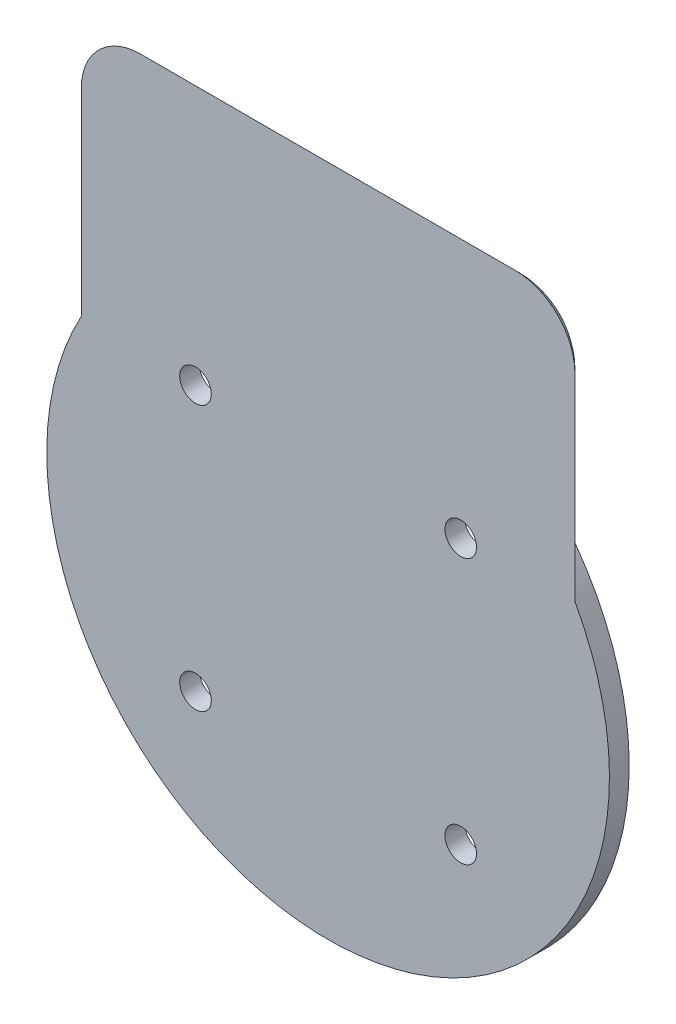
ISO-10303-21;
HEADER;
FILE_DESCRIPTION(('STEP AP214'),'2;1');
FILE_NAME('part.step','',(''),(''),'','','');
FILE_SCHEMA(('AUTOMOTIVE_DESIGN { 1 0 10303 214 1 1 1 1 }'));
ENDSEC;
DATA;
#1=APPLICATION_CONTEXT('core data for automotive mechanical design processes');
#2=APPLICATION_PROTOCOL_DEFINITION('international standard','automotive_design',2000,#1);
#3=PRODUCT_CONTEXT('',#1,'mechanical');
#4=PRODUCT('Part','Part','',(#3));
#5=PRODUCT_RELATED_PRODUCT_CATEGORY('part','',(#4));
#6=PRODUCT_DEFINITION_FORMATION('','',#4);
#7=PRODUCT_DEFINITION_CONTEXT('part definition',#1,'design');
#8=PRODUCT_DEFINITION('design','',#6,#7);
#9=PRODUCT_DEFINITION_SHAPE('','',#8);
#10=(LENGTH_UNIT() NAMED_UNIT(*) SI_UNIT(.MILLI.,.METRE.));
#11=(NAMED_UNIT(*) PLANE_ANGLE_UNIT() SI_UNIT($,.RADIAN.));
#12=(NAMED_UNIT(*) SI_UNIT($,.STERADIAN.) SOLID_ANGLE_UNIT());
#13=UNCERTAINTY_MEASURE_WITH_UNIT(LENGTH_MEASURE(1.E-05),#10,'distance_accuracy_value','');
#14=(GEOMETRIC_REPRESENTATION_CONTEXT(3) GLOBAL_UNCERTAINTY_ASSIGNED_CONTEXT((#13)) GLOBAL_UNIT_ASSIGNED_CONTEXT((#10,
#11,#12)) REPRESENTATION_CONTEXT('',''));
#15=CARTESIAN_POINT('',(0.,0.,0.));
#16=DIRECTION('',(0.,0.,1.));
#17=DIRECTION('',(1.,0.,0.));
#18=AXIS2_PLACEMENT_3D('',#15,#16,#17);
#19=CARTESIAN_POINT('',(-20.5278640450004,39.696938456699,-41.1));
#20=DIRECTION('',(0.,1.,0.));
#21=DIRECTION('',(0.,0.,1.));
#22=AXIS2_PLACEMENT_3D('',#19,#20,#21);
#23=CYLINDRICAL_SURFACE('',#22,6.);
#24=CARTESIAN_POINT('',(-25.,13.683932183404,-45.1));
#25=CARTESIAN_POINT('',(-24.9316533155713,13.8088031852223,-45.1764172188959));
#26=CARTESIAN_POINT('',(-24.8618021385521,13.9341930945905,-45.2506308573999));
#27=CARTESIAN_POINT('',(-24.7182644864457,14.1872754965675,-45.3956130666582));
#28=CARTESIAN_POINT('',(-24.644541913068,14.3149775198263,-45.4663292862519));
#29=CARTESIAN_POINT('',(-24.4931224391885,14.5725621096499,-45.6043165018991));
#30=CARTESIAN_POINT('',(-24.4153867515581,14.7024516673644,-45.6715318269254));
#31=CARTESIAN_POINT('',(-24.2558039743493,14.9642838700858,-45.8025256346511));
#32=CARTESIAN_POINT('',(-24.1739156060231,15.0962306010384,-45.8662456207196));
#33=CARTESIAN_POINT('',(-24.0087420272724,15.3575296447451,-45.9881254744884));
#34=CARTESIAN_POINT('',(-23.9255182847284,15.4868806193468,-46.0463715532978));
#35=CARTESIAN_POINT('',(-23.7563917629794,15.7450814461624,-46.1584324406634));
#36=CARTESIAN_POINT('',(-23.6704984335465,15.8739315748998,-46.2122608639766));
#37=CARTESIAN_POINT('',(-23.4960164446541,16.131066072179,-46.3154930018066));
#38=CARTESIAN_POINT('',(-23.407434939486,16.2593510526541,-46.3649072806787));
#39=CARTESIAN_POINT('',(-23.2275611020859,16.5152907344837,-46.4593159150301));
#40=CARTESIAN_POINT('',(-23.1362736437339,16.6429461371783,-46.5043176549434));
#41=CARTESIAN_POINT('',(-22.948084209444,16.9015315597402,-46.5912268794279));
#42=CARTESIAN_POINT('',(-22.8510959330607,17.0324440537818,-46.6329998840194));
#43=CARTESIAN_POINT('',(-22.6553511049898,17.2919391436373,-46.7111892522548));
#44=CARTESIAN_POINT('',(-22.5566299735149,17.4205307999583,-46.7476641291829));
#45=CARTESIAN_POINT('',(-22.3574848599523,17.675370557839,-46.8152622892751));
#46=CARTESIAN_POINT('',(-22.2570927390889,17.8016287197939,-46.8464414032887));
#47=CARTESIAN_POINT('',(-22.0546712300808,18.0517892039786,-46.9034516059615));
#48=CARTESIAN_POINT('',(-21.9526700631293,18.1757023455766,-46.9293353633259));
#49=CARTESIAN_POINT('',(-21.7416052093713,18.4277176755639,-46.9769915163599));
#50=CARTESIAN_POINT('',(-21.6324273277222,18.5557675653302,-46.9985360433891));
#51=CARTESIAN_POINT('',(-21.4132957409624,18.8081954729323,-47.0353802749903));
#52=CARTESIAN_POINT('',(-21.303388216914,18.9325986761571,-47.0507816676873));
#53=CARTESIAN_POINT('',(-21.0829244329362,19.1777740296513,-47.0753437096773));
#54=CARTESIAN_POINT('',(-20.9724082413396,19.2985722835046,-47.0846023871152));
#55=CARTESIAN_POINT('',(-20.750860133962,19.536577788044,-47.0968849346238));
#56=CARTESIAN_POINT('',(-20.6398619848515,19.6538117032703,-47.1000020380605));
#57=CARTESIAN_POINT('',(-20.5278640450005,19.7700985771437,-47.1));
#58=B_SPLINE_CURVE_WITH_KNOTS('',3,(#24,#25,#26,#27,#28,#29,#30,#31,#32,#33,#34,#35,#36,#37,#38,
#39,#40,#41,#42,#43,#44,#45,#46,#47,#48,#49,#50,#51,#52,#53,#54,#55,#56,#57),.UNSPECIFIED.,.F.,
.F.,(4,2,2,2,2,2,2,2,2,2,2,2,2,2,2,2,4),(0.,0.484668889562587,0.975183788082561,
1.47197597251438,1.97546058721739,2.46879216470734,2.9605412964569,3.45108009645755,
3.94078343778041,4.44527498435464,4.94368377681256,5.43645886362889,5.92406485820296,
6.43288522813079,6.93289368253222,7.42471748726127,7.90901571203432),.UNSPECIFIED.);
#59=CARTESIAN_POINT('',(-25.,13.683932183404,-45.1));
#60=VERTEX_POINT('',#59);
#61=CARTESIAN_POINT('',(-20.5278640450004,19.7700985771437,-47.1));
#62=VERTEX_POINT('',#61);
#63=EDGE_CURVE('E160',#60,#62,#58,.T.);
#64=ORIENTED_EDGE('',*,*,#63,.F.);
#65=DIRECTION('',(0.,1.,0.));
#66=VECTOR('',#65,1.);
#67=CARTESIAN_POINT('',(-25.,39.696938456699,-45.1));
#68=LINE('',#67,#66);
#69=CARTESIAN_POINT('',(-25.,33.6969384566991,-45.1));
#70=VERTEX_POINT('',#69);
#71=EDGE_CURVE('E139',#60,#70,#68,.T.);
#72=ORIENTED_EDGE('',*,*,#71,.T.);
#73=CARTESIAN_POINT('',(-20.5278640450004,33.6969384566991,-41.1));
#74=DIRECTION('',(0.,-1.,0.));
#75=DIRECTION('',(0.,0.,-1.));
#76=AXIS2_PLACEMENT_3D('',#73,#74,#75);
#77=CIRCLE('',#76,6.);
#78=CARTESIAN_POINT('',(-20.5278640450004,33.6969384566991,-47.1));
#79=VERTEX_POINT('',#78);
#80=EDGE_CURVE('E13',#70,#79,#77,.T.);
#81=ORIENTED_EDGE('',*,*,#80,.T.);
#82=DIRECTION('',(0.,1.,0.));
#83=VECTOR('',#82,1.);
#84=CARTESIAN_POINT('',(-20.5278640450004,33.6969384566991,-47.1));
#85=LINE('',#84,#83);
#86=EDGE_CURVE('E137',#62,#79,#85,.T.);
#87=ORIENTED_EDGE('',*,*,#86,.F.);
#88=EDGE_LOOP('',(#64,#72,#81,#87));
#89=FACE_BOUND('',#88,.T.);
#90=ADVANCED_FACE('F63',(#89),#23,.T.);
#91=CARTESIAN_POINT('',(-19.,33.6969384566991,-41.1));
#92=DIRECTION('',(0.,0.,1.));
#93=DIRECTION('',(1.,0.,0.));
#94=AXIS2_PLACEMENT_3D('',#91,#92,#93);
#95=DEGENERATE_TOROIDAL_SURFACE('',#94,1.52786404500042,6.,.T.);
#96=CARTESIAN_POINT('',(-19.,35.2248025016995,-41.1));
#97=DIRECTION('',(-1.,0.,0.));
#98=DIRECTION('',(0.,0.,1.));
#99=AXIS2_PLACEMENT_3D('',#96,#97,#98);
#100=CIRCLE('',#99,6.);
#101=CARTESIAN_POINT('',(-19.,39.696938456699,-45.1));
#102=VERTEX_POINT('',#101);
#103=CARTESIAN_POINT('',(-19.,35.2248025016995,-47.1));
#104=VERTEX_POINT('',#103);
#105=EDGE_CURVE('E73',#102,#104,#100,.T.);
#106=ORIENTED_EDGE('',*,*,#105,.T.);
#107=CARTESIAN_POINT('',(-19.,33.6969384566991,-47.1));
#108=DIRECTION('',(0.,0.,-1.));
#109=DIRECTION('',(-1.,0.,0.));
#110=AXIS2_PLACEMENT_3D('',#107,#108,#109);
#111=CIRCLE('',#110,1.52786404500041);
#112=EDGE_CURVE('E142',#79,#104,#111,.T.);
#113=ORIENTED_EDGE('',*,*,#112,.F.);
#114=ORIENTED_EDGE('',*,*,#80,.F.);
#115=CARTESIAN_POINT('',(-19.,33.6969384566991,-45.1));
#116=DIRECTION('',(0.,0.,1.));
#117=DIRECTION('',(-1.,0.,0.));
#118=AXIS2_PLACEMENT_3D('',#115,#116,#117);
#119=CIRCLE('',#118,6.);
#120=EDGE_CURVE('E287',#102,#70,#119,.T.);
#121=ORIENTED_EDGE('',*,*,#120,.F.);
#122=EDGE_LOOP('',(#106,#113,#114,#121));
#123=FACE_BOUND('',#122,.T.);
#124=ADVANCED_FACE('F143',(#123),#95,.T.);
#125=CARTESIAN_POINT('',(25.,35.2248025016995,-41.1));
#126=DIRECTION('',(1.,0.,0.));
#127=DIRECTION('',(0.,0.,-1.));
#128=AXIS2_PLACEMENT_3D('',#125,#126,#127);
#129=CYLINDRICAL_SURFACE('',#128,6.);
#130=CARTESIAN_POINT('',(19.,35.2248025016995,-41.1));
#131=DIRECTION('',(-1.,0.,0.));
#132=DIRECTION('',(0.,0.,1.));
#133=AXIS2_PLACEMENT_3D('',#130,#131,#132);
#134=CIRCLE('',#133,6.);
#135=CARTESIAN_POINT('',(19.,39.696938456699,-45.1));
#136=VERTEX_POINT('',#135);
#137=CARTESIAN_POINT('',(19.,35.2248025016995,-47.1));
#138=VERTEX_POINT('',#137);
#139=EDGE_CURVE('E286',#136,#138,#134,.T.);
#140=ORIENTED_EDGE('',*,*,#139,.T.);
#141=DIRECTION('',(1.,0.,0.));
#142=VECTOR('',#141,1.);
#143=CARTESIAN_POINT('',(19.,35.2248025016995,-47.1));
#144=LINE('',#143,#142);
#145=EDGE_CURVE('E147',#104,#138,#144,.T.);
#146=ORIENTED_EDGE('',*,*,#145,.F.);
#147=ORIENTED_EDGE('',*,*,#105,.F.);
#148=DIRECTION('',(1.,0.,0.));
#149=VECTOR('',#148,1.);
#150=CARTESIAN_POINT('',(25.,39.696938456699,-45.1));
#151=LINE('',#150,#149);
#152=EDGE_CURVE('E491',#102,#136,#151,.T.);
#153=ORIENTED_EDGE('',*,*,#152,.T.);
#154=EDGE_LOOP('',(#140,#146,#147,#153));
#155=FACE_BOUND('',#154,.T.);
#156=ADVANCED_FACE('F267',(#155),#129,.T.);
#157=CARTESIAN_POINT('',(19.,33.6969384566991,-41.1));
#158=DIRECTION('',(0.,0.,1.));
#159=DIRECTION('',(1.,0.,0.));
#160=AXIS2_PLACEMENT_3D('',#157,#158,#159);
#161=DEGENERATE_TOROIDAL_SURFACE('',#160,1.52786404500042,6.,.T.);
#162=CARTESIAN_POINT('',(20.5278640450004,33.6969384566991,-41.1));
#163=DIRECTION('',(0.,1.,0.));
#164=DIRECTION('',(0.,0.,1.));
#165=AXIS2_PLACEMENT_3D('',#162,#163,#164);
#166=CIRCLE('',#165,6.);
#167=CARTESIAN_POINT('',(25.,33.6969384566991,-45.1));
#168=VERTEX_POINT('',#167);
#169=CARTESIAN_POINT('',(20.5278640450004,33.6969384566991,-47.1));
#170=VERTEX_POINT('',#169);
#171=EDGE_CURVE('E283',#168,#170,#166,.T.);
#172=ORIENTED_EDGE('',*,*,#171,.T.);
#173=CARTESIAN_POINT('',(19.,33.6969384566991,-47.1));
#174=DIRECTION('',(0.,0.,-1.));
#175=DIRECTION('',(-1.,0.,0.));
#176=AXIS2_PLACEMENT_3D('',#173,#174,#175);
#177=CIRCLE('',#176,1.52786404500041);
#178=EDGE_CURVE('E371',#138,#170,#177,.T.);
#179=ORIENTED_EDGE('',*,*,#178,.F.);
#180=ORIENTED_EDGE('',*,*,#139,.F.);
#181=CARTESIAN_POINT('',(19.,33.6969384566991,-45.1));
#182=DIRECTION('',(0.,0.,1.));
#183=DIRECTION('',(-1.,0.,0.));
#184=AXIS2_PLACEMENT_3D('',#181,#182,#183);
#185=CIRCLE('',#184,6.);
#186=EDGE_CURVE('E365',#168,#136,#185,.T.);
#187=ORIENTED_EDGE('',*,*,#186,.F.);
#188=EDGE_LOOP('',(#172,#179,#180,#187));
#189=FACE_BOUND('',#188,.T.);
#190=ADVANCED_FACE('F386',(#189),#161,.T.);
#191=CARTESIAN_POINT('',(20.5278640450004,13.683932183404,-41.1));
#192=DIRECTION('',(0.,-1.,0.));
#193=DIRECTION('',(0.,0.,-1.));
#194=AXIS2_PLACEMENT_3D('',#191,#192,#193);
#195=CYLINDRICAL_SURFACE('',#194,6.);
#196=CARTESIAN_POINT('',(20.5278640450004,19.7700985771437,-47.1));
#197=CARTESIAN_POINT('',(20.6393434267797,19.6543500698832,-47.1000019568575));
#198=CARTESIAN_POINT('',(20.7498323429263,19.5376632403983,-47.096913202029));
#199=CARTESIAN_POINT('',(20.9703709706352,19.3007795761109,-47.0847419028513));
#200=CARTESIAN_POINT('',(21.0803873161818,19.1805563706097,-47.0755671764144));
#201=CARTESIAN_POINT('',(21.2998618004539,18.9365591094565,-47.0512274356552));
#202=CARTESIAN_POINT('',(21.4092803771805,18.812759236273,-47.0359655382079));
#203=CARTESIAN_POINT('',(21.6274458303953,18.5615662510633,-46.9994550951009));
#204=CARTESIAN_POINT('',(21.7361471356976,18.4341482220106,-46.9781060858789));
#205=CARTESIAN_POINT('',(21.946151280807,18.1835641156817,-46.930913905925));
#206=CARTESIAN_POINT('',(22.0475709931338,18.0604517338331,-46.9053043376565));
#207=CARTESIAN_POINT('',(22.2488625608406,17.8119049947444,-46.848899815042));
#208=CARTESIAN_POINT('',(22.348706452968,17.6864598701852,-46.8180525719507));
#209=CARTESIAN_POINT('',(22.5467883758123,17.4332574898128,-46.7511757950336));
#210=CARTESIAN_POINT('',(22.6449948737033,17.3054902143438,-46.715090903845));
#211=CARTESIAN_POINT('',(22.8397438743346,17.0476544001139,-46.6377391695908));
#212=CARTESIAN_POINT('',(22.9362513537693,16.9175768241062,-46.5964143659034));
#213=CARTESIAN_POINT('',(23.1248767034406,16.6587911765835,-46.5098211276752));
#214=CARTESIAN_POINT('',(23.2170389342015,16.5300922278791,-46.4646219545582));
#215=CARTESIAN_POINT('',(23.3986289433296,16.2720343558925,-46.3697347238481));
#216=CARTESIAN_POINT('',(23.4880513805086,16.1426746541155,-46.3200385628682));
#217=CARTESIAN_POINT('',(23.6641815327902,15.8833605587506,-46.2161590816208));
#218=CARTESIAN_POINT('',(23.7508815408469,15.753405494546,-46.1619643718389));
#219=CARTESIAN_POINT('',(23.9215874228584,15.4929655458489,-46.0490877604865));
#220=CARTESIAN_POINT('',(24.0055832098333,15.3624803541937,-45.9903913235231));
#221=CARTESIAN_POINT('',(24.1717362799501,15.0997239558912,-45.867918016232));
#222=CARTESIAN_POINT('',(24.253850616831,14.967453654645,-45.8040809180807));
#223=CARTESIAN_POINT('',(24.4138680682183,14.70497735687,-45.6728317241772));
#224=CARTESIAN_POINT('',(24.4918126298759,14.5747672759736,-45.6054783721327));
#225=CARTESIAN_POINT('',(24.6436333898155,14.3165454027045,-45.4671943879949));
#226=CARTESIAN_POINT('',(24.7175485190455,14.1885266067951,-45.3963196331808));
#227=CARTESIAN_POINT('',(24.8614555819086,13.9348152042406,-45.2509996286561));
#228=CARTESIAN_POINT('',(24.9314837320601,13.8091130438901,-45.1766068986082));
#229=CARTESIAN_POINT('',(25.,13.683932183404,-45.1));
#230=B_SPLINE_CURVE_WITH_KNOTS('',3,(#196,#197,#198,#199,#200,#201,#202,#203,#204,#205,#206,
#207,#208,#209,#210,#211,#212,#213,#214,#215,#216,#217,#218,#219,#220,#221,#222,#223,#224,#225,
#226,#227,#228,#229),.UNSPECIFIED.,.F.,.F.,(4,2,2,2,2,2,2,2,2,2,2,2,2,2,2,2,4),(0.,
0.48205652155537,0.971586588443077,1.46924048964314,1.97563721808018,2.46018858649223,
2.94989719858508,3.44522000838839,3.94659861989153,4.44037840778118,4.93506639244278,
5.43104745095901,5.92870346034508,6.43341470398941,6.93142246961669,7.42314490410264,
7.90901638415829),.UNSPECIFIED.);
#231=CARTESIAN_POINT('',(20.5278640450004,19.7700985771437,-47.1));
#232=VERTEX_POINT('',#231);
#233=CARTESIAN_POINT('',(25.,13.683932183404,-45.1));
#234=VERTEX_POINT('',#233);
#235=EDGE_CURVE('E154',#232,#234,#230,.T.);
#236=ORIENTED_EDGE('',*,*,#235,.F.);
#237=DIRECTION('',(0.,-1.,0.));
#238=VECTOR('',#237,1.);
#239=CARTESIAN_POINT('',(20.5278640450004,13.683932183404,-47.1));
#240=LINE('',#239,#238);
#241=EDGE_CURVE('E366',#170,#232,#240,.T.);
#242=ORIENTED_EDGE('',*,*,#241,.F.);
#243=ORIENTED_EDGE('',*,*,#171,.F.);
#244=DIRECTION('',(0.,-1.,0.));
#245=VECTOR('',#244,1.);
#246=CARTESIAN_POINT('',(25.,13.683932183404,-45.1));
#247=LINE('',#246,#245);
#248=EDGE_CURVE('E359',#168,#234,#247,.T.);
#249=ORIENTED_EDGE('',*,*,#248,.T.);
#250=EDGE_LOOP('',(#236,#242,#243,#249));
#251=FACE_BOUND('',#250,.T.);
#252=ADVANCED_FACE('F376',(#251),#195,.T.);
#253=CARTESIAN_POINT('',(0.,0.,-45.1));
#254=DIRECTION('',(0.,0.,-1.));
#255=DIRECTION('',(0.,-1.,0.));
#256=AXIS2_PLACEMENT_3D('',#253,#254,#255);
#257=PLANE('',#256);
#258=CARTESIAN_POINT('',(-13.4350288425443,-13.4350288425445,-45.1));
#259=DIRECTION('',(0.,0.,1.));
#260=DIRECTION('',(1.,0.,0.));
#261=AXIS2_PLACEMENT_3D('',#258,#259,#260);
#262=CIRCLE('',#261,1.59999999999999);
#263=CARTESIAN_POINT('',(-11.8350288425443,-13.4350288425445,-45.1));
#264=VERTEX_POINT('',#263);
#265=EDGE_CURVE('E463',#264,#264,#262,.T.);
#266=ORIENTED_EDGE('',*,*,#265,.F.);
#267=EDGE_LOOP('',(#266));
#268=FACE_BOUND('',#267,.T.);
#269=CARTESIAN_POINT('',(13.4350288425445,-13.4350288425443,-45.1));
#270=DIRECTION('',(0.,0.,1.));
#271=DIRECTION('',(1.,0.,0.));
#272=AXIS2_PLACEMENT_3D('',#269,#270,#271);
#273=CIRCLE('',#272,1.59999999999999);
#274=CARTESIAN_POINT('',(15.0350288425445,-13.4350288425443,-45.1));
#275=VERTEX_POINT('',#274);
#276=EDGE_CURVE('E468',#275,#275,#273,.T.);
#277=ORIENTED_EDGE('',*,*,#276,.F.);
#278=EDGE_LOOP('',(#277));
#279=FACE_BOUND('',#278,.T.);
#280=CARTESIAN_POINT('',(13.4350288425442,13.4350288425446,-45.1));
#281=DIRECTION('',(0.,0.,1.));
#282=DIRECTION('',(1.,0.,0.));
#283=AXIS2_PLACEMENT_3D('',#280,#281,#282);
#284=CIRCLE('',#283,1.59999999999999);
#285=CARTESIAN_POINT('',(15.0350288425442,13.4350288425446,-45.1));
#286=VERTEX_POINT('',#285);
#287=EDGE_CURVE('E474',#286,#286,#284,.T.);
#288=ORIENTED_EDGE('',*,*,#287,.F.);
#289=EDGE_LOOP('',(#288));
#290=FACE_BOUND('',#289,.T.);
#291=CARTESIAN_POINT('',(-13.4350288425446,13.4350288425442,-45.1));
#292=DIRECTION('',(0.,0.,1.));
#293=DIRECTION('',(1.,0.,0.));
#294=AXIS2_PLACEMENT_3D('',#291,#292,#293);
#295=CIRCLE('',#294,1.59999999999999);
#296=CARTESIAN_POINT('',(-11.8350288425446,13.4350288425442,-45.1));
#297=VERTEX_POINT('',#296);
#298=EDGE_CURVE('E482',#297,#297,#295,.T.);
#299=ORIENTED_EDGE('',*,*,#298,.F.);
#300=EDGE_LOOP('',(#299));
#301=FACE_BOUND('',#300,.T.);
#302=ORIENTED_EDGE('',*,*,#248,.F.);
#303=ORIENTED_EDGE('',*,*,#186,.T.);
#304=ORIENTED_EDGE('',*,*,#152,.F.);
#305=ORIENTED_EDGE('',*,*,#120,.T.);
#306=ORIENTED_EDGE('',*,*,#71,.F.);
#307=CARTESIAN_POINT('',(0.,0.,-45.1));
#308=DIRECTION('',(0.,0.,-1.));
#309=DIRECTION('',(-1.,0.,0.));
#310=AXIS2_PLACEMENT_3D('',#307,#308,#309);
#311=CIRCLE('',#310,28.5);
#312=EDGE_CURVE('E168',#234,#60,#311,.T.);
#313=ORIENTED_EDGE('',*,*,#312,.F.);
#314=EDGE_LOOP('',(#302,#303,#304,#305,#306,#313));
#315=FACE_BOUND('',#314,.T.);
#316=ADVANCED_FACE('F385',(#268,#279,#290,#301,#315),#257,.F.);
#317=CARTESIAN_POINT('',(0.,0.,-47.1));
#318=DIRECTION('',(0.,0.,-1.));
#319=DIRECTION('',(0.,-1.,0.));
#320=AXIS2_PLACEMENT_3D('',#317,#318,#319);
#321=PLANE('',#320);
#322=CARTESIAN_POINT('',(-13.4350288425443,-13.4350288425445,-47.1));
#323=DIRECTION('',(0.,0.,-1.));
#324=DIRECTION('',(-1.,0.,0.));
#325=AXIS2_PLACEMENT_3D('',#322,#323,#324);
#326=CIRCLE('',#325,1.59999999999999);
#327=CARTESIAN_POINT('',(-15.0350288425443,-13.4350288425445,-47.1));
#328=VERTEX_POINT('',#327);
#329=EDGE_CURVE('E460',#328,#328,#326,.T.);
#330=ORIENTED_EDGE('',*,*,#329,.F.);
#331=EDGE_LOOP('',(#330));
#332=FACE_BOUND('',#331,.T.);
#333=CARTESIAN_POINT('',(13.4350288425445,-13.4350288425443,-47.1));
#334=DIRECTION('',(0.,0.,-1.));
#335=DIRECTION('',(-1.,0.,0.));
#336=AXIS2_PLACEMENT_3D('',#333,#334,#335);
#337=CIRCLE('',#336,1.59999999999999);
#338=CARTESIAN_POINT('',(11.8350288425445,-13.4350288425443,-47.1));
#339=VERTEX_POINT('',#338);
#340=EDGE_CURVE('E67',#339,#339,#337,.T.);
#341=ORIENTED_EDGE('',*,*,#340,.F.);
#342=EDGE_LOOP('',(#341));
#343=FACE_BOUND('',#342,.T.);
#344=CARTESIAN_POINT('',(13.4350288425442,13.4350288425446,-47.1));
#345=DIRECTION('',(0.,0.,-1.));
#346=DIRECTION('',(-1.,0.,0.));
#347=AXIS2_PLACEMENT_3D('',#344,#345,#346);
#348=CIRCLE('',#347,1.59999999999999);
#349=CARTESIAN_POINT('',(11.8350288425443,13.4350288425446,-47.1));
#350=VERTEX_POINT('',#349);
#351=EDGE_CURVE('E478',#350,#350,#348,.T.);
#352=ORIENTED_EDGE('',*,*,#351,.F.);
#353=EDGE_LOOP('',(#352));
#354=FACE_BOUND('',#353,.T.);
#355=CARTESIAN_POINT('',(-13.4350288425446,13.4350288425442,-47.1));
#356=DIRECTION('',(0.,0.,-1.));
#357=DIRECTION('',(-1.,0.,0.));
#358=AXIS2_PLACEMENT_3D('',#355,#356,#357);
#359=CIRCLE('',#358,1.59999999999999);
#360=CARTESIAN_POINT('',(-15.0350288425446,13.4350288425442,-47.1));
#361=VERTEX_POINT('',#360);
#362=EDGE_CURVE('E169',#361,#361,#359,.T.);
#363=ORIENTED_EDGE('',*,*,#362,.F.);
#364=EDGE_LOOP('',(#363));
#365=FACE_BOUND('',#364,.T.);
#366=ORIENTED_EDGE('',*,*,#241,.T.);
#367=CARTESIAN_POINT('',(0.,0.,-47.1));
#368=DIRECTION('',(0.,0.,-1.));
#369=DIRECTION('',(-1.,0.,0.));
#370=AXIS2_PLACEMENT_3D('',#367,#368,#369);
#371=CIRCLE('',#370,28.5);
#372=EDGE_CURVE('E152',#232,#62,#371,.T.);
#373=ORIENTED_EDGE('',*,*,#372,.T.);
#374=ORIENTED_EDGE('',*,*,#86,.T.);
#375=ORIENTED_EDGE('',*,*,#112,.T.);
#376=ORIENTED_EDGE('',*,*,#145,.T.);
#377=ORIENTED_EDGE('',*,*,#178,.T.);
#378=EDGE_LOOP('',(#366,#373,#374,#375,#376,#377));
#379=FACE_BOUND('',#378,.T.);
#380=ADVANCED_FACE('F151',(#332,#343,#354,#365,#379),#321,.T.);
#381=CARTESIAN_POINT('',(0.,0.,-47.1));
#382=DIRECTION('',(0.,0.,1.));
#383=DIRECTION('',(1.,0.,0.));
#384=AXIS2_PLACEMENT_3D('',#381,#382,#383);
#385=CYLINDRICAL_SURFACE('',#384,28.5);
#386=ORIENTED_EDGE('',*,*,#372,.F.);
#387=ORIENTED_EDGE('',*,*,#235,.T.);
#388=ORIENTED_EDGE('',*,*,#312,.T.);
#389=ORIENTED_EDGE('',*,*,#63,.T.);
#390=EDGE_LOOP('',(#386,#387,#388,#389));
#391=FACE_BOUND('',#390,.T.);
#392=ADVANCED_FACE('F254',(#391),#385,.T.);
#393=CARTESIAN_POINT('',(-13.4350288425446,13.4350288425442,-45.1));
#394=DIRECTION('',(0.,0.,1.));
#395=DIRECTION('',(1.,0.,0.));
#396=AXIS2_PLACEMENT_3D('',#393,#394,#395);
#397=CYLINDRICAL_SURFACE('',#396,1.59999999999999);
#398=ORIENTED_EDGE('',*,*,#362,.T.);
#399=EDGE_LOOP('',(#398));
#400=FACE_BOUND('',#399,.T.);
#401=ORIENTED_EDGE('',*,*,#298,.T.);
#402=EDGE_LOOP('',(#401));
#403=FACE_BOUND('',#402,.T.);
#404=ADVANCED_FACE('F264',(#400,#403),#397,.F.);
#405=CARTESIAN_POINT('',(13.4350288425442,13.4350288425446,-45.1));
#406=DIRECTION('',(0.,0.,1.));
#407=DIRECTION('',(1.,0.,0.));
#408=AXIS2_PLACEMENT_3D('',#405,#406,#407);
#409=CYLINDRICAL_SURFACE('',#408,1.59999999999999);
#410=ORIENTED_EDGE('',*,*,#351,.T.);
#411=EDGE_LOOP('',(#410));
#412=FACE_BOUND('',#411,.T.);
#413=ORIENTED_EDGE('',*,*,#287,.T.);
#414=EDGE_LOOP('',(#413));
#415=FACE_BOUND('',#414,.T.);
#416=ADVANCED_FACE('F422',(#412,#415),#409,.F.);
#417=CARTESIAN_POINT('',(13.4350288425445,-13.4350288425443,-45.1));
#418=DIRECTION('',(0.,0.,1.));
#419=DIRECTION('',(1.,0.,0.));
#420=AXIS2_PLACEMENT_3D('',#417,#418,#419);
#421=CYLINDRICAL_SURFACE('',#420,1.59999999999999);
#422=ORIENTED_EDGE('',*,*,#340,.T.);
#423=EDGE_LOOP('',(#422));
#424=FACE_BOUND('',#423,.T.);
#425=ORIENTED_EDGE('',*,*,#276,.T.);
#426=EDGE_LOOP('',(#425));
#427=FACE_BOUND('',#426,.T.);
#428=ADVANCED_FACE('F430',(#424,#427),#421,.F.);
#429=CARTESIAN_POINT('',(-13.4350288425443,-13.4350288425445,-45.1));
#430=DIRECTION('',(0.,0.,1.));
#431=DIRECTION('',(1.,0.,0.));
#432=AXIS2_PLACEMENT_3D('',#429,#430,#431);
#433=CYLINDRICAL_SURFACE('',#432,1.59999999999999);
#434=ORIENTED_EDGE('',*,*,#329,.T.);
#435=EDGE_LOOP('',(#434));
#436=FACE_BOUND('',#435,.T.);
#437=ORIENTED_EDGE('',*,*,#265,.T.);
#438=EDGE_LOOP('',(#437));
#439=FACE_BOUND('',#438,.T.);
#440=ADVANCED_FACE('F439',(#436,#439),#433,.F.);
#441=CLOSED_SHELL('',(#90,#124,#156,#190,#252,#316,#380,#392,#404,#416,#428,#440));
#442=MANIFOLD_SOLID_BREP('B2',#441);
#443=ADVANCED_BREP_SHAPE_REPRESENTATION('',(#18,#442),#14);
#444=SHAPE_DEFINITION_REPRESENTATION(#9,#443);
ENDSEC;
END-ISO-10303-21;
